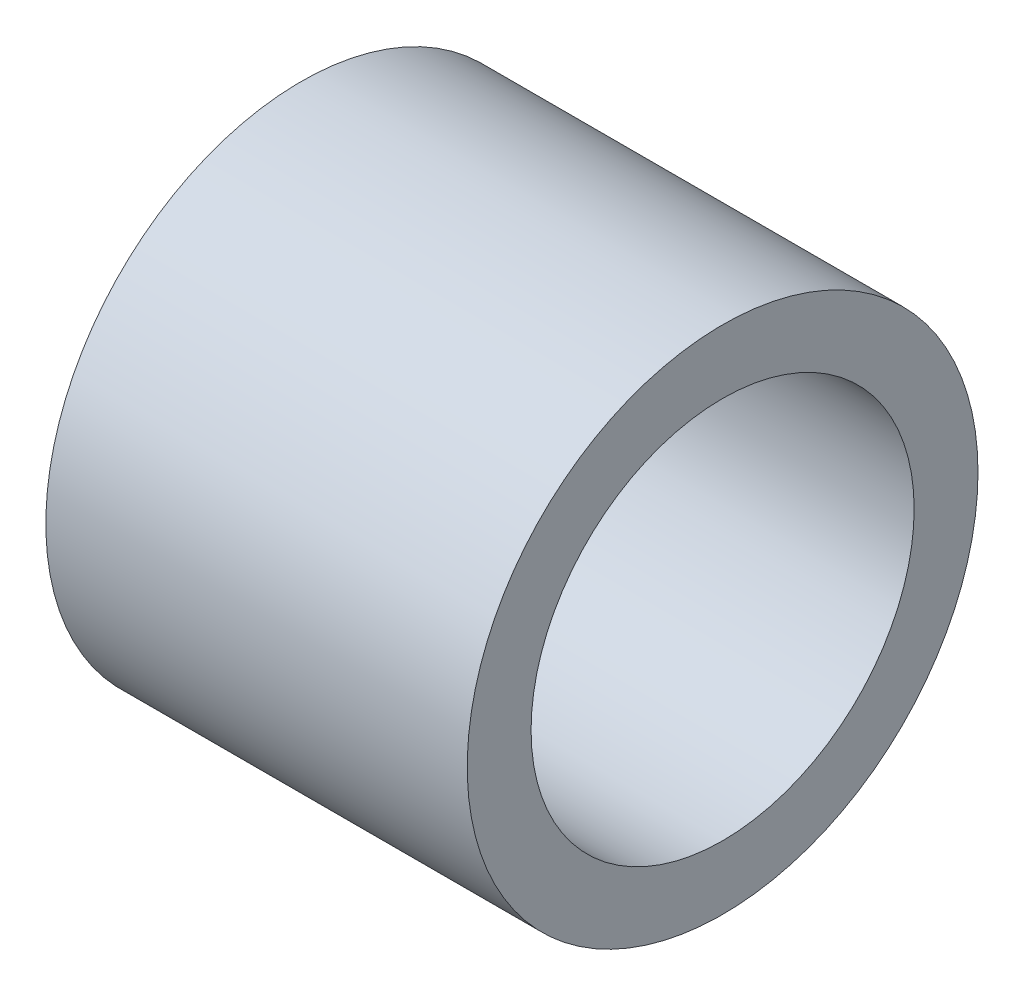
ISO-10303-21;
HEADER;
FILE_DESCRIPTION(('STEP AP214'),'2;1');
FILE_NAME('part.step','',(''),(''),'','','');
FILE_SCHEMA(('AUTOMOTIVE_DESIGN { 1 0 10303 214 1 1 1 1 }'));
ENDSEC;
DATA;
#1=APPLICATION_CONTEXT('core data for automotive mechanical design processes');
#2=APPLICATION_PROTOCOL_DEFINITION('international standard','automotive_design',2000,#1);
#3=PRODUCT_CONTEXT('',#1,'mechanical');
#4=PRODUCT('Part','Part','',(#3));
#5=PRODUCT_RELATED_PRODUCT_CATEGORY('part','',(#4));
#6=PRODUCT_DEFINITION_FORMATION('','',#4);
#7=PRODUCT_DEFINITION_CONTEXT('part definition',#1,'design');
#8=PRODUCT_DEFINITION('design','',#6,#7);
#9=PRODUCT_DEFINITION_SHAPE('','',#8);
#10=(LENGTH_UNIT() NAMED_UNIT(*) SI_UNIT(.MILLI.,.METRE.));
#11=(NAMED_UNIT(*) PLANE_ANGLE_UNIT() SI_UNIT($,.RADIAN.));
#12=(NAMED_UNIT(*) SI_UNIT($,.STERADIAN.) SOLID_ANGLE_UNIT());
#13=UNCERTAINTY_MEASURE_WITH_UNIT(LENGTH_MEASURE(1.E-05),#10,'distance_accuracy_value','');
#14=(GEOMETRIC_REPRESENTATION_CONTEXT(3) GLOBAL_UNCERTAINTY_ASSIGNED_CONTEXT((#13)) GLOBAL_UNIT_ASSIGNED_CONTEXT((#10,
#11,#12)) REPRESENTATION_CONTEXT('',''));
#15=CARTESIAN_POINT('',(0.,0.,0.));
#16=DIRECTION('',(0.,0.,1.));
#17=DIRECTION('',(1.,0.,0.));
#18=AXIS2_PLACEMENT_3D('',#15,#16,#17);
#19=CARTESIAN_POINT('',(8.25,0.,0.));
#20=DIRECTION('',(1.,0.,0.));
#21=DIRECTION('',(0.,0.,-1.));
#22=AXIS2_PLACEMENT_3D('',#19,#20,#21);
#23=PLANE('',#22);
#24=CARTESIAN_POINT('',(8.25,0.,0.));
#25=DIRECTION('',(1.,0.,0.));
#26=DIRECTION('',(0.,0.,-1.));
#27=AXIS2_PLACEMENT_3D('',#24,#25,#26);
#28=CIRCLE('',#27,10.);
#29=CARTESIAN_POINT('',(8.25,0.,-10.));
#30=VERTEX_POINT('',#29);
#31=EDGE_CURVE('E10',#30,#30,#28,.T.);
#32=ORIENTED_EDGE('',*,*,#31,.T.);
#33=EDGE_LOOP('',(#32));
#34=FACE_BOUND('',#33,.T.);
#35=CARTESIAN_POINT('',(8.25,0.,0.));
#36=DIRECTION('',(1.,0.,0.));
#37=DIRECTION('',(0.,0.,-1.));
#38=AXIS2_PLACEMENT_3D('',#35,#36,#37);
#39=CIRCLE('',#38,7.5);
#40=CARTESIAN_POINT('',(8.25,0.,-7.5));
#41=VERTEX_POINT('',#40);
#42=EDGE_CURVE('E50',#41,#41,#39,.T.);
#43=ORIENTED_EDGE('',*,*,#42,.F.);
#44=EDGE_LOOP('',(#43));
#45=FACE_BOUND('',#44,.T.);
#46=ADVANCED_FACE('F37',(#34,#45),#23,.T.);
#47=CARTESIAN_POINT('',(-8.25,0.,0.));
#48=DIRECTION('',(1.,0.,0.));
#49=DIRECTION('',(0.,0.,-1.));
#50=AXIS2_PLACEMENT_3D('',#47,#48,#49);
#51=PLANE('',#50);
#52=CARTESIAN_POINT('',(-8.25,0.,0.));
#53=DIRECTION('',(1.,0.,0.));
#54=DIRECTION('',(0.,0.,-1.));
#55=AXIS2_PLACEMENT_3D('',#52,#53,#54);
#56=CIRCLE('',#55,10.);
#57=CARTESIAN_POINT('',(-8.25,0.,-10.));
#58=VERTEX_POINT('',#57);
#59=EDGE_CURVE('E41',#58,#58,#56,.T.);
#60=ORIENTED_EDGE('',*,*,#59,.F.);
#61=EDGE_LOOP('',(#60));
#62=FACE_BOUND('',#61,.T.);
#63=CARTESIAN_POINT('',(-8.25,0.,0.));
#64=DIRECTION('',(1.,0.,0.));
#65=DIRECTION('',(0.,0.,-1.));
#66=AXIS2_PLACEMENT_3D('',#63,#64,#65);
#67=CIRCLE('',#66,7.5);
#68=CARTESIAN_POINT('',(-8.25,0.,-7.5));
#69=VERTEX_POINT('',#68);
#70=EDGE_CURVE('E52',#69,#69,#67,.T.);
#71=ORIENTED_EDGE('',*,*,#70,.T.);
#72=EDGE_LOOP('',(#71));
#73=FACE_BOUND('',#72,.T.);
#74=ADVANCED_FACE('F64',(#62,#73),#51,.F.);
#75=CARTESIAN_POINT('',(8.25,0.,0.));
#76=DIRECTION('',(-1.,0.,0.));
#77=DIRECTION('',(0.,0.,1.));
#78=AXIS2_PLACEMENT_3D('',#75,#76,#77);
#79=CYLINDRICAL_SURFACE('',#78,10.);
#80=ORIENTED_EDGE('',*,*,#31,.F.);
#81=EDGE_LOOP('',(#80));
#82=FACE_BOUND('',#81,.T.);
#83=ORIENTED_EDGE('',*,*,#59,.T.);
#84=EDGE_LOOP('',(#83));
#85=FACE_BOUND('',#84,.T.);
#86=ADVANCED_FACE('F39',(#82,#85),#79,.T.);
#87=CARTESIAN_POINT('',(8.25,0.,0.));
#88=DIRECTION('',(-1.,0.,0.));
#89=DIRECTION('',(0.,0.,1.));
#90=AXIS2_PLACEMENT_3D('',#87,#88,#89);
#91=CYLINDRICAL_SURFACE('',#90,7.5);
#92=ORIENTED_EDGE('',*,*,#42,.T.);
#93=EDGE_LOOP('',(#92));
#94=FACE_BOUND('',#93,.T.);
#95=ORIENTED_EDGE('',*,*,#70,.F.);
#96=EDGE_LOOP('',(#95));
#97=FACE_BOUND('',#96,.T.);
#98=ADVANCED_FACE('F60',(#94,#97),#91,.F.);
#99=CLOSED_SHELL('',(#46,#74,#86,#98));
#100=MANIFOLD_SOLID_BREP('B2',#99);
#101=ADVANCED_BREP_SHAPE_REPRESENTATION('',(#18,#100),#14);
#102=SHAPE_DEFINITION_REPRESENTATION(#9,#101);
ENDSEC;
END-ISO-10303-21;
